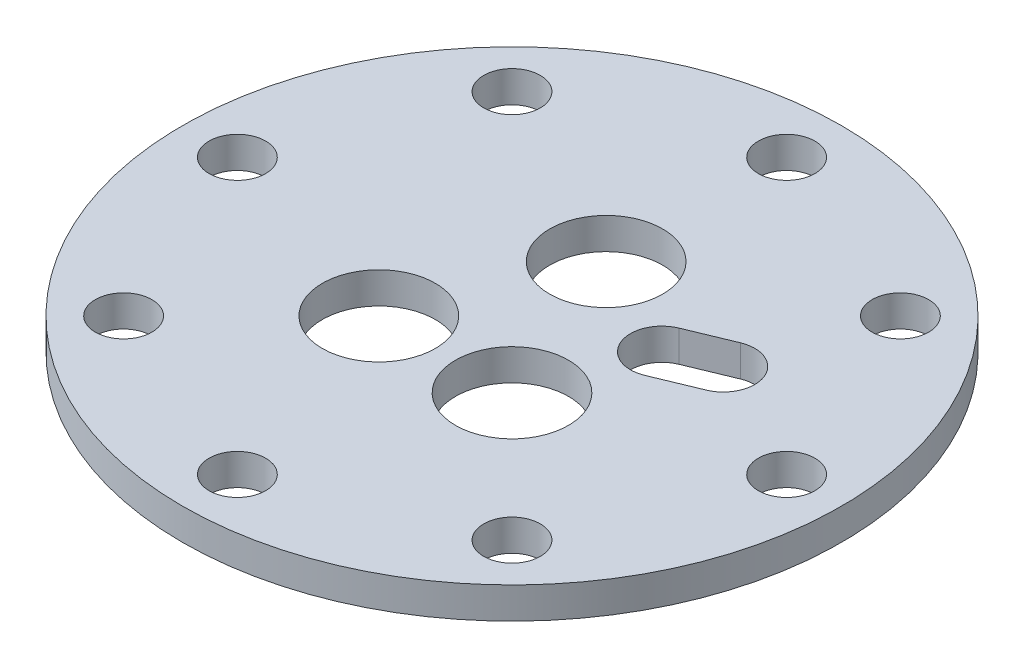
ISO-10303-21;
HEADER;
FILE_DESCRIPTION(('STEP AP214'),'2;1');
FILE_NAME('part.step','',(''),(''),'','','');
FILE_SCHEMA(('AUTOMOTIVE_DESIGN { 1 0 10303 214 1 1 1 1 }'));
ENDSEC;
DATA;
#1=APPLICATION_CONTEXT('core data for automotive mechanical design processes');
#2=APPLICATION_PROTOCOL_DEFINITION('international standard','automotive_design',2000,#1);
#3=PRODUCT_CONTEXT('',#1,'mechanical');
#4=PRODUCT('Part','Part','',(#3));
#5=PRODUCT_RELATED_PRODUCT_CATEGORY('part','',(#4));
#6=PRODUCT_DEFINITION_FORMATION('','',#4);
#7=PRODUCT_DEFINITION_CONTEXT('part definition',#1,'design');
#8=PRODUCT_DEFINITION('design','',#6,#7);
#9=PRODUCT_DEFINITION_SHAPE('','',#8);
#10=(LENGTH_UNIT() NAMED_UNIT(*) SI_UNIT(.MILLI.,.METRE.));
#11=(NAMED_UNIT(*) PLANE_ANGLE_UNIT() SI_UNIT($,.RADIAN.));
#12=(NAMED_UNIT(*) SI_UNIT($,.STERADIAN.) SOLID_ANGLE_UNIT());
#13=UNCERTAINTY_MEASURE_WITH_UNIT(LENGTH_MEASURE(1.E-05),#10,'distance_accuracy_value','');
#14=(GEOMETRIC_REPRESENTATION_CONTEXT(3) GLOBAL_UNCERTAINTY_ASSIGNED_CONTEXT((#13)) GLOBAL_UNIT_ASSIGNED_CONTEXT((#10,
#11,#12)) REPRESENTATION_CONTEXT('',''));
#15=CARTESIAN_POINT('',(0.,0.,0.));
#16=DIRECTION('',(0.,0.,1.));
#17=DIRECTION('',(1.,0.,0.));
#18=AXIS2_PLACEMENT_3D('',#15,#16,#17);
#19=CARTESIAN_POINT('',(33.7600927369355,10.,-13.9838882786121));
#20=DIRECTION('',(0.,-1.,0.));
#21=DIRECTION('',(0.,0.,-1.));
#22=AXIS2_PLACEMENT_3D('',#19,#20,#21);
#23=CYLINDRICAL_SURFACE('',#22,10.);
#24=CARTESIAN_POINT('',(33.7600927369355,0.,-13.9838882786121));
#25=DIRECTION('',(0.,1.,0.));
#26=DIRECTION('',(0.,0.,1.));
#27=AXIS2_PLACEMENT_3D('',#24,#25,#26);
#28=CIRCLE('',#27,10.);
#29=CARTESIAN_POINT('',(29.9332584132846,0.,-23.222683603725));
#30=VERTEX_POINT('',#29);
#31=CARTESIAN_POINT('',(37.5869270605864,0.,-4.74509295349925));
#32=VERTEX_POINT('',#31);
#33=EDGE_CURVE('E132',#30,#32,#28,.T.);
#34=ORIENTED_EDGE('',*,*,#33,.F.);
#35=DIRECTION('',(0.,-1.,0.));
#36=VECTOR('',#35,1.);
#37=CARTESIAN_POINT('',(29.9332584132846,10.,-23.222683603725));
#38=LINE('',#37,#36);
#39=CARTESIAN_POINT('',(29.9332584132846,10.,-23.222683603725));
#40=VERTEX_POINT('',#39);
#41=EDGE_CURVE('E11',#40,#30,#38,.T.);
#42=ORIENTED_EDGE('',*,*,#41,.F.);
#43=CARTESIAN_POINT('',(33.7600927369355,10.,-13.9838882786121));
#44=DIRECTION('',(0.,1.,0.));
#45=DIRECTION('',(0.,0.,1.));
#46=AXIS2_PLACEMENT_3D('',#43,#44,#45);
#47=CIRCLE('',#46,10.);
#48=CARTESIAN_POINT('',(37.5869270605864,10.,-4.74509295349925));
#49=VERTEX_POINT('',#48);
#50=EDGE_CURVE('E89',#40,#49,#47,.T.);
#51=ORIENTED_EDGE('',*,*,#50,.T.);
#52=DIRECTION('',(0.,-1.,0.));
#53=VECTOR('',#52,1.);
#54=CARTESIAN_POINT('',(37.5869270605864,10.,-4.74509295349925));
#55=LINE('',#54,#53);
#56=EDGE_CURVE('E70',#49,#32,#55,.T.);
#57=ORIENTED_EDGE('',*,*,#56,.T.);
#58=EDGE_LOOP('',(#34,#42,#51,#57));
#59=FACE_BOUND('',#58,.T.);
#60=ADVANCED_FACE('F32',(#59),#23,.F.);
#61=CARTESIAN_POINT('',(-3.8268343236509,10.,-9.23879532511286));
#62=DIRECTION('',(0.38268343236509,0.,0.923879532511287));
#63=DIRECTION('',(0.923879532511287,0.,-0.38268343236509));
#64=AXIS2_PLACEMENT_3D('',#61,#62,#63);
#65=PLANE('',#64);
#66=DIRECTION('',(-0.923879532511287,0.,0.38268343236509));
#67=VECTOR('',#66,1.);
#68=CARTESIAN_POINT('',(-3.8268343236509,0.,-9.23879532511286));
#69=LINE('',#68,#67);
#70=CARTESIAN_POINT('',(43.7914514009539,0.,-28.9629350892013));
#71=VERTEX_POINT('',#70);
#72=EDGE_CURVE('E81',#71,#30,#69,.T.);
#73=ORIENTED_EDGE('',*,*,#72,.F.);
#74=DIRECTION('',(0.,-1.,0.));
#75=VECTOR('',#74,1.);
#76=CARTESIAN_POINT('',(43.7914514009539,10.,-28.9629350892013));
#77=LINE('',#76,#75);
#78=CARTESIAN_POINT('',(43.7914514009539,10.,-28.9629350892013));
#79=VERTEX_POINT('',#78);
#80=EDGE_CURVE('E40',#79,#71,#77,.T.);
#81=ORIENTED_EDGE('',*,*,#80,.F.);
#82=DIRECTION('',(-0.923879532511287,0.,0.38268343236509));
#83=VECTOR('',#82,1.);
#84=CARTESIAN_POINT('',(-3.8268343236509,10.,-9.23879532511286));
#85=LINE('',#84,#83);
#86=EDGE_CURVE('E79',#79,#40,#85,.T.);
#87=ORIENTED_EDGE('',*,*,#86,.T.);
#88=ORIENTED_EDGE('',*,*,#41,.T.);
#89=EDGE_LOOP('',(#73,#81,#87,#88));
#90=FACE_BOUND('',#89,.T.);
#91=ADVANCED_FACE('F78',(#90),#65,.T.);
#92=CARTESIAN_POINT('',(47.6182857246048,10.,-19.7241397640885));
#93=DIRECTION('',(0.,-1.,0.));
#94=DIRECTION('',(0.,0.,-1.));
#95=AXIS2_PLACEMENT_3D('',#92,#93,#94);
#96=CYLINDRICAL_SURFACE('',#95,10.);
#97=CARTESIAN_POINT('',(47.6182857246048,0.,-19.7241397640885));
#98=DIRECTION('',(0.,1.,0.));
#99=DIRECTION('',(0.,0.,1.));
#100=AXIS2_PLACEMENT_3D('',#97,#98,#99);
#101=CIRCLE('',#100,10.);
#102=CARTESIAN_POINT('',(51.4451200482557,0.,-10.4853444389756));
#103=VERTEX_POINT('',#102);
#104=EDGE_CURVE('E136',#103,#71,#101,.T.);
#105=ORIENTED_EDGE('',*,*,#104,.F.);
#106=DIRECTION('',(0.,-1.,0.));
#107=VECTOR('',#106,1.);
#108=CARTESIAN_POINT('',(51.4451200482557,10.,-10.4853444389756));
#109=LINE('',#108,#107);
#110=CARTESIAN_POINT('',(51.4451200482557,10.,-10.4853444389756));
#111=VERTEX_POINT('',#110);
#112=EDGE_CURVE('E63',#111,#103,#109,.T.);
#113=ORIENTED_EDGE('',*,*,#112,.F.);
#114=CARTESIAN_POINT('',(47.6182857246048,10.,-19.7241397640885));
#115=DIRECTION('',(0.,1.,0.));
#116=DIRECTION('',(0.,0.,1.));
#117=AXIS2_PLACEMENT_3D('',#114,#115,#116);
#118=CIRCLE('',#117,10.);
#119=EDGE_CURVE('E88',#111,#79,#118,.T.);
#120=ORIENTED_EDGE('',*,*,#119,.T.);
#121=ORIENTED_EDGE('',*,*,#80,.T.);
#122=EDGE_LOOP('',(#105,#113,#120,#121));
#123=FACE_BOUND('',#122,.T.);
#124=ADVANCED_FACE('F91',(#123),#96,.F.);
#125=CARTESIAN_POINT('',(0.,10.,-87.5));
#126=DIRECTION('',(0.,-1.,0.));
#127=DIRECTION('',(0.,0.,-1.));
#128=AXIS2_PLACEMENT_3D('',#125,#126,#127);
#129=CYLINDRICAL_SURFACE('',#128,8.99999999999999);
#130=CARTESIAN_POINT('',(0.,10.,-87.5));
#131=DIRECTION('',(0.,1.,0.));
#132=DIRECTION('',(0.,0.,1.));
#133=AXIS2_PLACEMENT_3D('',#130,#131,#132);
#134=CIRCLE('',#133,8.99999999999999);
#135=CARTESIAN_POINT('',(0.,10.,-78.5));
#136=VERTEX_POINT('',#135);
#137=EDGE_CURVE('E126',#136,#136,#134,.T.);
#138=ORIENTED_EDGE('',*,*,#137,.T.);
#139=EDGE_LOOP('',(#138));
#140=FACE_BOUND('',#139,.T.);
#141=CARTESIAN_POINT('',(0.,0.,-87.5));
#142=DIRECTION('',(0.,1.,0.));
#143=DIRECTION('',(0.,0.,1.));
#144=AXIS2_PLACEMENT_3D('',#141,#142,#143);
#145=CIRCLE('',#144,8.99999999999999);
#146=CARTESIAN_POINT('',(0.,0.,-78.5));
#147=VERTEX_POINT('',#146);
#148=EDGE_CURVE('E170',#147,#147,#145,.T.);
#149=ORIENTED_EDGE('',*,*,#148,.F.);
#150=EDGE_LOOP('',(#149));
#151=FACE_BOUND('',#150,.T.);
#152=ADVANCED_FACE('F186',(#140,#151),#129,.F.);
#153=CARTESIAN_POINT('',(61.871843353826,10.,-61.8718433538242));
#154=DIRECTION('',(0.,-1.,0.));
#155=DIRECTION('',(0.,0.,-1.));
#156=AXIS2_PLACEMENT_3D('',#153,#154,#155);
#157=CYLINDRICAL_SURFACE('',#156,8.99999999999801);
#158=CARTESIAN_POINT('',(61.871843353826,10.,-61.8718433538242));
#159=DIRECTION('',(0.,1.,0.));
#160=DIRECTION('',(0.,0.,1.));
#161=AXIS2_PLACEMENT_3D('',#158,#159,#160);
#162=CIRCLE('',#161,8.99999999999801);
#163=CARTESIAN_POINT('',(61.871843353826,10.,-52.8718433538262));
#164=VERTEX_POINT('',#163);
#165=EDGE_CURVE('E123',#164,#164,#162,.T.);
#166=ORIENTED_EDGE('',*,*,#165,.T.);
#167=EDGE_LOOP('',(#166));
#168=FACE_BOUND('',#167,.T.);
#169=CARTESIAN_POINT('',(61.871843353826,0.,-61.8718433538242));
#170=DIRECTION('',(0.,1.,0.));
#171=DIRECTION('',(0.,0.,1.));
#172=AXIS2_PLACEMENT_3D('',#169,#170,#171);
#173=CIRCLE('',#172,8.99999999999801);
#174=CARTESIAN_POINT('',(61.871843353826,0.,-52.8718433538262));
#175=VERTEX_POINT('',#174);
#176=EDGE_CURVE('E167',#175,#175,#173,.T.);
#177=ORIENTED_EDGE('',*,*,#176,.F.);
#178=EDGE_LOOP('',(#177));
#179=FACE_BOUND('',#178,.T.);
#180=ADVANCED_FACE('F228',(#168,#179),#157,.F.);
#181=CARTESIAN_POINT('',(-61.8718433538242,10.,-61.8718433538198));
#182=DIRECTION('',(0.,-1.,0.));
#183=DIRECTION('',(0.,0.,-1.));
#184=AXIS2_PLACEMENT_3D('',#181,#182,#183);
#185=CYLINDRICAL_SURFACE('',#184,9.00000000000437);
#186=CARTESIAN_POINT('',(-61.8718433538242,10.,-61.8718433538198));
#187=DIRECTION('',(0.,1.,0.));
#188=DIRECTION('',(0.,0.,1.));
#189=AXIS2_PLACEMENT_3D('',#186,#187,#188);
#190=CIRCLE('',#189,9.00000000000437);
#191=CARTESIAN_POINT('',(-61.8718433538242,10.,-52.8718433538154));
#192=VERTEX_POINT('',#191);
#193=EDGE_CURVE('E120',#192,#192,#190,.T.);
#194=ORIENTED_EDGE('',*,*,#193,.T.);
#195=EDGE_LOOP('',(#194));
#196=FACE_BOUND('',#195,.T.);
#197=CARTESIAN_POINT('',(-61.8718433538242,0.,-61.8718433538198));
#198=DIRECTION('',(0.,1.,0.));
#199=DIRECTION('',(0.,0.,1.));
#200=AXIS2_PLACEMENT_3D('',#197,#198,#199);
#201=CIRCLE('',#200,9.00000000000437);
#202=CARTESIAN_POINT('',(-61.8718433538242,0.,-52.8718433538154));
#203=VERTEX_POINT('',#202);
#204=EDGE_CURVE('E164',#203,#203,#201,.T.);
#205=ORIENTED_EDGE('',*,*,#204,.F.);
#206=EDGE_LOOP('',(#205));
#207=FACE_BOUND('',#206,.T.);
#208=ADVANCED_FACE('F224',(#196,#207),#185,.F.);
#209=CARTESIAN_POINT('',(-87.5,10.,6.21944463933198E-12));
#210=DIRECTION('',(0.,-1.,0.));
#211=DIRECTION('',(0.,0.,-1.));
#212=AXIS2_PLACEMENT_3D('',#209,#210,#211);
#213=CYLINDRICAL_SURFACE('',#212,9.00000000000682);
#214=CARTESIAN_POINT('',(-87.5,10.,6.21944463933198E-12));
#215=DIRECTION('',(0.,1.,0.));
#216=DIRECTION('',(0.,0.,1.));
#217=AXIS2_PLACEMENT_3D('',#214,#215,#216);
#218=CIRCLE('',#217,9.00000000000682);
#219=CARTESIAN_POINT('',(-87.5,10.,9.00000000001303));
#220=VERTEX_POINT('',#219);
#221=EDGE_CURVE('E117',#220,#220,#218,.T.);
#222=ORIENTED_EDGE('',*,*,#221,.T.);
#223=EDGE_LOOP('',(#222));
#224=FACE_BOUND('',#223,.T.);
#225=CARTESIAN_POINT('',(-87.5,0.,6.21944463933198E-12));
#226=DIRECTION('',(0.,1.,0.));
#227=DIRECTION('',(0.,0.,1.));
#228=AXIS2_PLACEMENT_3D('',#225,#226,#227);
#229=CIRCLE('',#228,9.00000000000682);
#230=CARTESIAN_POINT('',(-87.5,0.,9.00000000001303));
#231=VERTEX_POINT('',#230);
#232=EDGE_CURVE('E161',#231,#231,#229,.T.);
#233=ORIENTED_EDGE('',*,*,#232,.F.);
#234=EDGE_LOOP('',(#233));
#235=FACE_BOUND('',#234,.T.);
#236=ADVANCED_FACE('F220',(#224,#235),#213,.F.);
#237=CARTESIAN_POINT('',(-61.8718433538198,10.,61.8718433538304));
#238=DIRECTION('',(0.,-1.,0.));
#239=DIRECTION('',(0.,0.,-1.));
#240=AXIS2_PLACEMENT_3D('',#237,#238,#239);
#241=CYLINDRICAL_SURFACE('',#240,9.00000000000701);
#242=CARTESIAN_POINT('',(-61.8718433538198,10.,61.8718433538304));
#243=DIRECTION('',(0.,1.,0.));
#244=DIRECTION('',(0.,0.,1.));
#245=AXIS2_PLACEMENT_3D('',#242,#243,#244);
#246=CIRCLE('',#245,9.00000000000701);
#247=CARTESIAN_POINT('',(-61.8718433538198,10.,70.8718433538374));
#248=VERTEX_POINT('',#247);
#249=EDGE_CURVE('E114',#248,#248,#246,.T.);
#250=ORIENTED_EDGE('',*,*,#249,.T.);
#251=EDGE_LOOP('',(#250));
#252=FACE_BOUND('',#251,.T.);
#253=CARTESIAN_POINT('',(-61.8718433538198,0.,61.8718433538304));
#254=DIRECTION('',(0.,1.,0.));
#255=DIRECTION('',(0.,0.,1.));
#256=AXIS2_PLACEMENT_3D('',#253,#254,#255);
#257=CIRCLE('',#256,9.00000000000701);
#258=CARTESIAN_POINT('',(-61.8718433538198,0.,70.8718433538374));
#259=VERTEX_POINT('',#258);
#260=EDGE_CURVE('E158',#259,#259,#257,.T.);
#261=ORIENTED_EDGE('',*,*,#260,.F.);
#262=EDGE_LOOP('',(#261));
#263=FACE_BOUND('',#262,.T.);
#264=ADVANCED_FACE('F216',(#252,#263),#241,.F.);
#265=CARTESIAN_POINT('',(6.22796459739364E-12,10.,87.5000000000062));
#266=DIRECTION('',(0.,-1.,0.));
#267=DIRECTION('',(0.,0.,-1.));
#268=AXIS2_PLACEMENT_3D('',#265,#266,#267);
#269=CYLINDRICAL_SURFACE('',#268,9.00000000000473);
#270=CARTESIAN_POINT('',(6.22796459739364E-12,10.,87.5000000000062));
#271=DIRECTION('',(0.,1.,0.));
#272=DIRECTION('',(0.,0.,1.));
#273=AXIS2_PLACEMENT_3D('',#270,#271,#272);
#274=CIRCLE('',#273,9.00000000000473);
#275=CARTESIAN_POINT('',(6.22796459739364E-12,10.,96.5000000000109));
#276=VERTEX_POINT('',#275);
#277=EDGE_CURVE('E111',#276,#276,#274,.T.);
#278=ORIENTED_EDGE('',*,*,#277,.T.);
#279=EDGE_LOOP('',(#278));
#280=FACE_BOUND('',#279,.T.);
#281=CARTESIAN_POINT('',(6.22796459739364E-12,0.,87.5000000000062));
#282=DIRECTION('',(0.,1.,0.));
#283=DIRECTION('',(0.,0.,1.));
#284=AXIS2_PLACEMENT_3D('',#281,#282,#283);
#285=CIRCLE('',#284,9.00000000000473);
#286=CARTESIAN_POINT('',(6.22796459739364E-12,0.,96.5000000000109));
#287=VERTEX_POINT('',#286);
#288=EDGE_CURVE('E155',#287,#287,#285,.T.);
#289=ORIENTED_EDGE('',*,*,#288,.F.);
#290=EDGE_LOOP('',(#289));
#291=FACE_BOUND('',#290,.T.);
#292=ADVANCED_FACE('F212',(#280,#291),#269,.F.);
#293=CARTESIAN_POINT('',(61.8718433538304,10.,61.871843353826));
#294=DIRECTION('',(0.,-1.,0.));
#295=DIRECTION('',(0.,0.,-1.));
#296=AXIS2_PLACEMENT_3D('',#293,#294,#295);
#297=CYLINDRICAL_SURFACE('',#296,9.00000000000124);
#298=CARTESIAN_POINT('',(61.8718433538304,10.,61.871843353826));
#299=DIRECTION('',(0.,1.,0.));
#300=DIRECTION('',(0.,0.,1.));
#301=AXIS2_PLACEMENT_3D('',#298,#299,#300);
#302=CIRCLE('',#301,9.00000000000124);
#303=CARTESIAN_POINT('',(61.8718433538304,10.,70.8718433538272));
#304=VERTEX_POINT('',#303);
#305=EDGE_CURVE('E108',#304,#304,#302,.T.);
#306=ORIENTED_EDGE('',*,*,#305,.T.);
#307=EDGE_LOOP('',(#306));
#308=FACE_BOUND('',#307,.T.);
#309=CARTESIAN_POINT('',(61.8718433538304,0.,61.871843353826));
#310=DIRECTION('',(0.,1.,0.));
#311=DIRECTION('',(0.,0.,1.));
#312=AXIS2_PLACEMENT_3D('',#309,#310,#311);
#313=CIRCLE('',#312,9.00000000000124);
#314=CARTESIAN_POINT('',(61.8718433538304,0.,70.8718433538272));
#315=VERTEX_POINT('',#314);
#316=EDGE_CURVE('E152',#315,#315,#313,.T.);
#317=ORIENTED_EDGE('',*,*,#316,.F.);
#318=EDGE_LOOP('',(#317));
#319=FACE_BOUND('',#318,.T.);
#320=ADVANCED_FACE('F208',(#308,#319),#297,.F.);
#321=CARTESIAN_POINT('',(87.5000000000062,10.,0.));
#322=DIRECTION('',(0.,-1.,0.));
#323=DIRECTION('',(0.,0.,-1.));
#324=AXIS2_PLACEMENT_3D('',#321,#322,#323);
#325=CYLINDRICAL_SURFACE('',#324,8.99999999999849);
#326=CARTESIAN_POINT('',(87.5000000000062,10.,0.));
#327=DIRECTION('',(0.,1.,0.));
#328=DIRECTION('',(0.,0.,1.));
#329=AXIS2_PLACEMENT_3D('',#326,#327,#328);
#330=CIRCLE('',#329,8.99999999999849);
#331=CARTESIAN_POINT('',(87.5000000000062,10.,8.99999999999849));
#332=VERTEX_POINT('',#331);
#333=EDGE_CURVE('E105',#332,#332,#330,.T.);
#334=ORIENTED_EDGE('',*,*,#333,.T.);
#335=EDGE_LOOP('',(#334));
#336=FACE_BOUND('',#335,.T.);
#337=CARTESIAN_POINT('',(87.5000000000062,0.,0.));
#338=DIRECTION('',(0.,1.,0.));
#339=DIRECTION('',(0.,0.,1.));
#340=AXIS2_PLACEMENT_3D('',#337,#338,#339);
#341=CIRCLE('',#340,8.99999999999849);
#342=CARTESIAN_POINT('',(87.5000000000062,0.,8.99999999999849));
#343=VERTEX_POINT('',#342);
#344=EDGE_CURVE('E149',#343,#343,#341,.T.);
#345=ORIENTED_EDGE('',*,*,#344,.F.);
#346=EDGE_LOOP('',(#345));
#347=FACE_BOUND('',#346,.T.);
#348=ADVANCED_FACE('F204',(#336,#347),#325,.F.);
#349=CARTESIAN_POINT('',(0.,10.,-30.));
#350=DIRECTION('',(0.,-1.,0.));
#351=DIRECTION('',(0.,0.,-1.));
#352=AXIS2_PLACEMENT_3D('',#349,#350,#351);
#353=CYLINDRICAL_SURFACE('',#352,18.);
#354=CARTESIAN_POINT('',(0.,10.,-30.));
#355=DIRECTION('',(0.,1.,0.));
#356=DIRECTION('',(0.,0.,1.));
#357=AXIS2_PLACEMENT_3D('',#354,#355,#356);
#358=CIRCLE('',#357,18.);
#359=CARTESIAN_POINT('',(0.,10.,-12.));
#360=VERTEX_POINT('',#359);
#361=EDGE_CURVE('E102',#360,#360,#358,.T.);
#362=ORIENTED_EDGE('',*,*,#361,.T.);
#363=EDGE_LOOP('',(#362));
#364=FACE_BOUND('',#363,.T.);
#365=CARTESIAN_POINT('',(0.,0.,-30.));
#366=DIRECTION('',(0.,1.,0.));
#367=DIRECTION('',(0.,0.,1.));
#368=AXIS2_PLACEMENT_3D('',#365,#366,#367);
#369=CIRCLE('',#368,18.);
#370=CARTESIAN_POINT('',(0.,0.,-12.));
#371=VERTEX_POINT('',#370);
#372=EDGE_CURVE('E146',#371,#371,#369,.T.);
#373=ORIENTED_EDGE('',*,*,#372,.F.);
#374=EDGE_LOOP('',(#373));
#375=FACE_BOUND('',#374,.T.);
#376=ADVANCED_FACE('F200',(#364,#375),#353,.F.);
#377=CARTESIAN_POINT('',(21.2132034355963,10.,21.2132034355965));
#378=DIRECTION('',(0.,-1.,0.));
#379=DIRECTION('',(0.,0.,-1.));
#380=AXIS2_PLACEMENT_3D('',#377,#378,#379);
#381=CYLINDRICAL_SURFACE('',#380,18.);
#382=CARTESIAN_POINT('',(21.2132034355963,10.,21.2132034355965));
#383=DIRECTION('',(0.,1.,0.));
#384=DIRECTION('',(0.,0.,1.));
#385=AXIS2_PLACEMENT_3D('',#382,#383,#384);
#386=CIRCLE('',#385,18.);
#387=CARTESIAN_POINT('',(21.2132034355963,10.,39.2132034355965));
#388=VERTEX_POINT('',#387);
#389=EDGE_CURVE('E99',#388,#388,#386,.T.);
#390=ORIENTED_EDGE('',*,*,#389,.T.);
#391=EDGE_LOOP('',(#390));
#392=FACE_BOUND('',#391,.T.);
#393=CARTESIAN_POINT('',(21.2132034355963,0.,21.2132034355965));
#394=DIRECTION('',(0.,1.,0.));
#395=DIRECTION('',(0.,0.,1.));
#396=AXIS2_PLACEMENT_3D('',#393,#394,#395);
#397=CIRCLE('',#396,18.);
#398=CARTESIAN_POINT('',(21.2132034355963,0.,39.2132034355965));
#399=VERTEX_POINT('',#398);
#400=EDGE_CURVE('E143',#399,#399,#397,.T.);
#401=ORIENTED_EDGE('',*,*,#400,.F.);
#402=EDGE_LOOP('',(#401));
#403=FACE_BOUND('',#402,.T.);
#404=ADVANCED_FACE('F196',(#392,#403),#381,.F.);
#405=CARTESIAN_POINT('',(-21.2132034355963,10.,21.2132034355965));
#406=DIRECTION('',(0.,-1.,0.));
#407=DIRECTION('',(0.,0.,-1.));
#408=AXIS2_PLACEMENT_3D('',#405,#406,#407);
#409=CYLINDRICAL_SURFACE('',#408,18.);
#410=CARTESIAN_POINT('',(-21.2132034355963,10.,21.2132034355965));
#411=DIRECTION('',(0.,1.,0.));
#412=DIRECTION('',(0.,0.,1.));
#413=AXIS2_PLACEMENT_3D('',#410,#411,#412);
#414=CIRCLE('',#413,18.);
#415=CARTESIAN_POINT('',(-21.2132034355963,10.,39.2132034355965));
#416=VERTEX_POINT('',#415);
#417=EDGE_CURVE('E93',#416,#416,#414,.T.);
#418=ORIENTED_EDGE('',*,*,#417,.T.);
#419=EDGE_LOOP('',(#418));
#420=FACE_BOUND('',#419,.T.);
#421=CARTESIAN_POINT('',(-21.2132034355963,0.,21.2132034355965));
#422=DIRECTION('',(0.,1.,0.));
#423=DIRECTION('',(0.,0.,1.));
#424=AXIS2_PLACEMENT_3D('',#421,#422,#423);
#425=CIRCLE('',#424,18.);
#426=CARTESIAN_POINT('',(-21.2132034355963,0.,39.2132034355965));
#427=VERTEX_POINT('',#426);
#428=EDGE_CURVE('E140',#427,#427,#425,.T.);
#429=ORIENTED_EDGE('',*,*,#428,.F.);
#430=EDGE_LOOP('',(#429));
#431=FACE_BOUND('',#430,.T.);
#432=ADVANCED_FACE('F193',(#420,#431),#409,.F.);
#433=CARTESIAN_POINT('',(3.82683432365091,10.,9.23879532511287));
#434=DIRECTION('',(0.382683432365091,0.,0.923879532511287));
#435=DIRECTION('',(0.923879532511287,0.,-0.382683432365091));
#436=AXIS2_PLACEMENT_3D('',#433,#434,#435);
#437=PLANE('',#436);
#438=DIRECTION('',(-0.923879532511287,0.,0.382683432365091));
#439=VECTOR('',#438,1.);
#440=CARTESIAN_POINT('',(3.82683432365091,0.,9.23879532511287));
#441=LINE('',#440,#439);
#442=EDGE_CURVE('E138',#103,#32,#441,.T.);
#443=ORIENTED_EDGE('',*,*,#442,.T.);
#444=ORIENTED_EDGE('',*,*,#56,.F.);
#445=DIRECTION('',(-0.923879532511287,0.,0.382683432365091));
#446=VECTOR('',#445,1.);
#447=CARTESIAN_POINT('',(3.82683432365091,10.,9.23879532511287));
#448=LINE('',#447,#446);
#449=EDGE_CURVE('E48',#111,#49,#448,.T.);
#450=ORIENTED_EDGE('',*,*,#449,.F.);
#451=ORIENTED_EDGE('',*,*,#112,.T.);
#452=EDGE_LOOP('',(#443,#444,#450,#451));
#453=FACE_BOUND('',#452,.T.);
#454=ADVANCED_FACE('F189',(#453),#437,.F.);
#455=CARTESIAN_POINT('',(0.,10.,0.));
#456=DIRECTION('',(0.,-1.,0.));
#457=DIRECTION('',(0.,0.,-1.));
#458=AXIS2_PLACEMENT_3D('',#455,#456,#457);
#459=CYLINDRICAL_SURFACE('',#458,105.);
#460=CARTESIAN_POINT('',(0.,10.,0.));
#461=DIRECTION('',(0.,1.,0.));
#462=DIRECTION('',(0.,0.,1.));
#463=AXIS2_PLACEMENT_3D('',#460,#461,#462);
#464=CIRCLE('',#463,105.);
#465=CARTESIAN_POINT('',(0.,10.,105.));
#466=VERTEX_POINT('',#465);
#467=EDGE_CURVE('E129',#466,#466,#464,.T.);
#468=ORIENTED_EDGE('',*,*,#467,.F.);
#469=EDGE_LOOP('',(#468));
#470=FACE_BOUND('',#469,.T.);
#471=CARTESIAN_POINT('',(0.,0.,0.));
#472=DIRECTION('',(0.,1.,0.));
#473=DIRECTION('',(0.,0.,1.));
#474=AXIS2_PLACEMENT_3D('',#471,#472,#473);
#475=CIRCLE('',#474,105.);
#476=CARTESIAN_POINT('',(0.,0.,105.));
#477=VERTEX_POINT('',#476);
#478=EDGE_CURVE('E173',#477,#477,#475,.T.);
#479=ORIENTED_EDGE('',*,*,#478,.T.);
#480=EDGE_LOOP('',(#479));
#481=FACE_BOUND('',#480,.T.);
#482=ADVANCED_FACE('F192',(#470,#481),#459,.T.);
#483=CARTESIAN_POINT('',(0.,10.,0.));
#484=DIRECTION('',(0.,1.,0.));
#485=DIRECTION('',(0.,0.,1.));
#486=AXIS2_PLACEMENT_3D('',#483,#484,#485);
#487=PLANE('',#486);
#488=ORIENTED_EDGE('',*,*,#50,.F.);
#489=ORIENTED_EDGE('',*,*,#86,.F.);
#490=ORIENTED_EDGE('',*,*,#119,.F.);
#491=ORIENTED_EDGE('',*,*,#449,.T.);
#492=EDGE_LOOP('',(#488,#489,#490,#491));
#493=FACE_BOUND('',#492,.T.);
#494=ORIENTED_EDGE('',*,*,#417,.F.);
#495=EDGE_LOOP('',(#494));
#496=FACE_BOUND('',#495,.T.);
#497=ORIENTED_EDGE('',*,*,#389,.F.);
#498=EDGE_LOOP('',(#497));
#499=FACE_BOUND('',#498,.T.);
#500=ORIENTED_EDGE('',*,*,#361,.F.);
#501=EDGE_LOOP('',(#500));
#502=FACE_BOUND('',#501,.T.);
#503=ORIENTED_EDGE('',*,*,#333,.F.);
#504=EDGE_LOOP('',(#503));
#505=FACE_BOUND('',#504,.T.);
#506=ORIENTED_EDGE('',*,*,#305,.F.);
#507=EDGE_LOOP('',(#506));
#508=FACE_BOUND('',#507,.T.);
#509=ORIENTED_EDGE('',*,*,#277,.F.);
#510=EDGE_LOOP('',(#509));
#511=FACE_BOUND('',#510,.T.);
#512=ORIENTED_EDGE('',*,*,#249,.F.);
#513=EDGE_LOOP('',(#512));
#514=FACE_BOUND('',#513,.T.);
#515=ORIENTED_EDGE('',*,*,#221,.F.);
#516=EDGE_LOOP('',(#515));
#517=FACE_BOUND('',#516,.T.);
#518=ORIENTED_EDGE('',*,*,#193,.F.);
#519=EDGE_LOOP('',(#518));
#520=FACE_BOUND('',#519,.T.);
#521=ORIENTED_EDGE('',*,*,#165,.F.);
#522=EDGE_LOOP('',(#521));
#523=FACE_BOUND('',#522,.T.);
#524=ORIENTED_EDGE('',*,*,#137,.F.);
#525=EDGE_LOOP('',(#524));
#526=FACE_BOUND('',#525,.T.);
#527=ORIENTED_EDGE('',*,*,#467,.T.);
#528=EDGE_LOOP('',(#527));
#529=FACE_BOUND('',#528,.T.);
#530=ADVANCED_FACE('F86',(#493,#496,#499,#502,#505,#508,#511,#514,#517,#520,#523,#526,#529),
#487,.T.);
#531=CARTESIAN_POINT('',(0.,0.,0.));
#532=DIRECTION('',(0.,1.,0.));
#533=DIRECTION('',(0.,0.,1.));
#534=AXIS2_PLACEMENT_3D('',#531,#532,#533);
#535=PLANE('',#534);
#536=ORIENTED_EDGE('',*,*,#33,.T.);
#537=ORIENTED_EDGE('',*,*,#442,.F.);
#538=ORIENTED_EDGE('',*,*,#104,.T.);
#539=ORIENTED_EDGE('',*,*,#72,.T.);
#540=EDGE_LOOP('',(#536,#537,#538,#539));
#541=FACE_BOUND('',#540,.T.);
#542=ORIENTED_EDGE('',*,*,#428,.T.);
#543=EDGE_LOOP('',(#542));
#544=FACE_BOUND('',#543,.T.);
#545=ORIENTED_EDGE('',*,*,#400,.T.);
#546=EDGE_LOOP('',(#545));
#547=FACE_BOUND('',#546,.T.);
#548=ORIENTED_EDGE('',*,*,#372,.T.);
#549=EDGE_LOOP('',(#548));
#550=FACE_BOUND('',#549,.T.);
#551=ORIENTED_EDGE('',*,*,#344,.T.);
#552=EDGE_LOOP('',(#551));
#553=FACE_BOUND('',#552,.T.);
#554=ORIENTED_EDGE('',*,*,#316,.T.);
#555=EDGE_LOOP('',(#554));
#556=FACE_BOUND('',#555,.T.);
#557=ORIENTED_EDGE('',*,*,#288,.T.);
#558=EDGE_LOOP('',(#557));
#559=FACE_BOUND('',#558,.T.);
#560=ORIENTED_EDGE('',*,*,#260,.T.);
#561=EDGE_LOOP('',(#560));
#562=FACE_BOUND('',#561,.T.);
#563=ORIENTED_EDGE('',*,*,#232,.T.);
#564=EDGE_LOOP('',(#563));
#565=FACE_BOUND('',#564,.T.);
#566=ORIENTED_EDGE('',*,*,#204,.T.);
#567=EDGE_LOOP('',(#566));
#568=FACE_BOUND('',#567,.T.);
#569=ORIENTED_EDGE('',*,*,#176,.T.);
#570=EDGE_LOOP('',(#569));
#571=FACE_BOUND('',#570,.T.);
#572=ORIENTED_EDGE('',*,*,#148,.T.);
#573=EDGE_LOOP('',(#572));
#574=FACE_BOUND('',#573,.T.);
#575=ORIENTED_EDGE('',*,*,#478,.F.);
#576=EDGE_LOOP('',(#575));
#577=FACE_BOUND('',#576,.T.);
#578=ADVANCED_FACE('F239',(#541,#544,#547,#550,#553,#556,#559,#562,#565,#568,#571,#574,#577),
#535,.F.);
#579=CLOSED_SHELL('',(#60,#91,#124,#152,#180,#208,#236,#264,#292,#320,#348,#376,#404,#432,#454,
#482,#530,#578));
#580=MANIFOLD_SOLID_BREP('B2',#579);
#581=ADVANCED_BREP_SHAPE_REPRESENTATION('',(#18,#580),#14);
#582=SHAPE_DEFINITION_REPRESENTATION(#9,#581);
ENDSEC;
END-ISO-10303-21;
